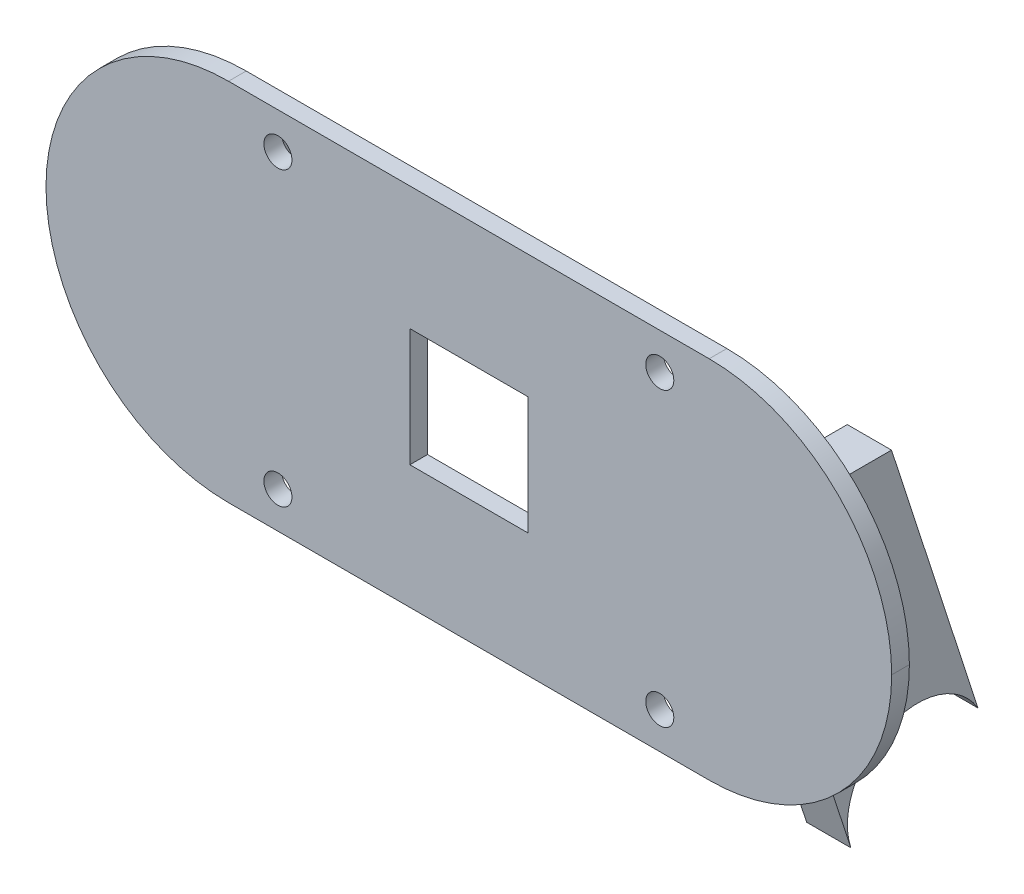
ISO-10303-21;
HEADER;
FILE_DESCRIPTION(('STEP AP214'),'2;1');
FILE_NAME('part.step','',(''),(''),'','','');
FILE_SCHEMA(('AUTOMOTIVE_DESIGN { 1 0 10303 214 1 1 1 1 }'));
ENDSEC;
DATA;
#1=APPLICATION_CONTEXT('core data for automotive mechanical design processes');
#2=APPLICATION_PROTOCOL_DEFINITION('international standard','automotive_design',2000,#1);
#3=PRODUCT_CONTEXT('',#1,'mechanical');
#4=PRODUCT('Part','Part','',(#3));
#5=PRODUCT_RELATED_PRODUCT_CATEGORY('part','',(#4));
#6=PRODUCT_DEFINITION_FORMATION('','',#4);
#7=PRODUCT_DEFINITION_CONTEXT('part definition',#1,'design');
#8=PRODUCT_DEFINITION('design','',#6,#7);
#9=PRODUCT_DEFINITION_SHAPE('','',#8);
#10=(LENGTH_UNIT() NAMED_UNIT(*) SI_UNIT(.MILLI.,.METRE.));
#11=(NAMED_UNIT(*) PLANE_ANGLE_UNIT() SI_UNIT($,.RADIAN.));
#12=(NAMED_UNIT(*) SI_UNIT($,.STERADIAN.) SOLID_ANGLE_UNIT());
#13=UNCERTAINTY_MEASURE_WITH_UNIT(LENGTH_MEASURE(1.E-05),#10,'distance_accuracy_value','');
#14=(GEOMETRIC_REPRESENTATION_CONTEXT(3) GLOBAL_UNCERTAINTY_ASSIGNED_CONTEXT((#13)) GLOBAL_UNIT_ASSIGNED_CONTEXT((#10,
#11,#12)) REPRESENTATION_CONTEXT('',''));
#15=CARTESIAN_POINT('',(0.,0.,0.));
#16=DIRECTION('',(0.,0.,1.));
#17=DIRECTION('',(1.,0.,0.));
#18=AXIS2_PLACEMENT_3D('',#15,#16,#17);
#19=CARTESIAN_POINT('',(0.,0.,4.));
#20=DIRECTION('',(0.,0.,1.));
#21=DIRECTION('',(1.,0.,0.));
#22=AXIS2_PLACEMENT_3D('',#19,#20,#21);
#23=PLANE('',#22);
#24=CARTESIAN_POINT('',(43.18,-33.02,4.));
#25=DIRECTION('',(0.,0.,1.));
#26=DIRECTION('',(1.,0.,0.));
#27=AXIS2_PLACEMENT_3D('',#24,#25,#26);
#28=CIRCLE('',#27,3.175);
#29=CARTESIAN_POINT('',(46.355,-33.02,4.));
#30=VERTEX_POINT('',#29);
#31=EDGE_CURVE('E295',#30,#30,#28,.T.);
#32=ORIENTED_EDGE('',*,*,#31,.F.);
#33=EDGE_LOOP('',(#32));
#34=FACE_BOUND('',#33,.T.);
#35=CARTESIAN_POINT('',(-43.18,33.02,4.));
#36=DIRECTION('',(0.,0.,1.));
#37=DIRECTION('',(1.,0.,0.));
#38=AXIS2_PLACEMENT_3D('',#35,#36,#37);
#39=CIRCLE('',#38,3.175);
#40=CARTESIAN_POINT('',(-40.005,33.02,4.));
#41=VERTEX_POINT('',#40);
#42=EDGE_CURVE('E307',#41,#41,#39,.T.);
#43=ORIENTED_EDGE('',*,*,#42,.F.);
#44=EDGE_LOOP('',(#43));
#45=FACE_BOUND('',#44,.T.);
#46=DIRECTION('',(1.,0.,0.));
#47=VECTOR('',#46,1.);
#48=CARTESIAN_POINT('',(-95.631,-41.275,4.));
#49=LINE('',#48,#47);
#50=CARTESIAN_POINT('',(-54.356,-41.275,4.));
#51=VERTEX_POINT('',#50);
#52=CARTESIAN_POINT('',(54.356,-41.275,4.));
#53=VERTEX_POINT('',#52);
#54=EDGE_CURVE('E316',#51,#53,#49,.T.);
#55=ORIENTED_EDGE('',*,*,#54,.T.);
#56=CARTESIAN_POINT('',(54.356,0.,4.));
#57=DIRECTION('',(0.,0.,1.));
#58=DIRECTION('',(1.,0.,0.));
#59=AXIS2_PLACEMENT_3D('',#56,#57,#58);
#60=CIRCLE('',#59,41.275);
#61=CARTESIAN_POINT('',(95.631,0.,4.));
#62=VERTEX_POINT('',#61);
#63=EDGE_CURVE('E344',#53,#62,#60,.T.);
#64=ORIENTED_EDGE('',*,*,#63,.T.);
#65=CARTESIAN_POINT('',(54.356,0.,4.));
#66=DIRECTION('',(0.,0.,1.));
#67=DIRECTION('',(1.,0.,0.));
#68=AXIS2_PLACEMENT_3D('',#65,#66,#67);
#69=CIRCLE('',#68,41.275);
#70=CARTESIAN_POINT('',(54.356,41.275,4.));
#71=VERTEX_POINT('',#70);
#72=EDGE_CURVE('E342',#62,#71,#69,.T.);
#73=ORIENTED_EDGE('',*,*,#72,.T.);
#74=DIRECTION('',(-1.,0.,0.));
#75=VECTOR('',#74,1.);
#76=CARTESIAN_POINT('',(-95.631,41.275,4.));
#77=LINE('',#76,#75);
#78=CARTESIAN_POINT('',(-54.356,41.275,4.));
#79=VERTEX_POINT('',#78);
#80=EDGE_CURVE('E313',#71,#79,#77,.T.);
#81=ORIENTED_EDGE('',*,*,#80,.T.);
#82=CARTESIAN_POINT('',(-54.356,0.,4.));
#83=DIRECTION('',(0.,0.,1.));
#84=DIRECTION('',(1.,0.,0.));
#85=AXIS2_PLACEMENT_3D('',#82,#83,#84);
#86=CIRCLE('',#85,41.275);
#87=CARTESIAN_POINT('',(-95.631,0.,4.));
#88=VERTEX_POINT('',#87);
#89=EDGE_CURVE('E338',#79,#88,#86,.T.);
#90=ORIENTED_EDGE('',*,*,#89,.T.);
#91=CARTESIAN_POINT('',(-54.356,0.,4.));
#92=DIRECTION('',(0.,0.,1.));
#93=DIRECTION('',(1.,0.,0.));
#94=AXIS2_PLACEMENT_3D('',#91,#92,#93);
#95=CIRCLE('',#94,41.275);
#96=EDGE_CURVE('E340',#88,#51,#95,.T.);
#97=ORIENTED_EDGE('',*,*,#96,.T.);
#98=EDGE_LOOP('',(#55,#64,#73,#81,#90,#97));
#99=FACE_BOUND('',#98,.T.);
#100=CARTESIAN_POINT('',(43.18,33.02,4.));
#101=DIRECTION('',(0.,0.,1.));
#102=DIRECTION('',(1.,0.,0.));
#103=AXIS2_PLACEMENT_3D('',#100,#101,#102);
#104=CIRCLE('',#103,3.175);
#105=CARTESIAN_POINT('',(46.355,33.02,4.));
#106=VERTEX_POINT('',#105);
#107=EDGE_CURVE('E301',#106,#106,#104,.T.);
#108=ORIENTED_EDGE('',*,*,#107,.F.);
#109=EDGE_LOOP('',(#108));
#110=FACE_BOUND('',#109,.T.);
#111=CARTESIAN_POINT('',(-43.18,-33.02,4.));
#112=DIRECTION('',(0.,0.,1.));
#113=DIRECTION('',(1.,0.,0.));
#114=AXIS2_PLACEMENT_3D('',#111,#112,#113);
#115=CIRCLE('',#114,3.175);
#116=CARTESIAN_POINT('',(-40.005,-33.02,4.));
#117=VERTEX_POINT('',#116);
#118=EDGE_CURVE('E289',#117,#117,#115,.T.);
#119=ORIENTED_EDGE('',*,*,#118,.F.);
#120=EDGE_LOOP('',(#119));
#121=FACE_BOUND('',#120,.T.);
#122=DIRECTION('',(-1.,0.,0.));
#123=VECTOR('',#122,1.);
#124=CARTESIAN_POINT('',(-13.335,13.335,4.));
#125=LINE('',#124,#123);
#126=CARTESIAN_POINT('',(13.335,13.335,4.));
#127=VERTEX_POINT('',#126);
#128=CARTESIAN_POINT('',(-13.335,13.335,4.));
#129=VERTEX_POINT('',#128);
#130=EDGE_CURVE('E258',#127,#129,#125,.T.);
#131=ORIENTED_EDGE('',*,*,#130,.F.);
#132=DIRECTION('',(0.,1.,0.));
#133=VECTOR('',#132,1.);
#134=CARTESIAN_POINT('',(13.335,13.335,4.));
#135=LINE('',#134,#133);
#136=CARTESIAN_POINT('',(13.335,-13.335,4.));
#137=VERTEX_POINT('',#136);
#138=EDGE_CURVE('E256',#137,#127,#135,.T.);
#139=ORIENTED_EDGE('',*,*,#138,.F.);
#140=DIRECTION('',(1.,0.,0.));
#141=VECTOR('',#140,1.);
#142=CARTESIAN_POINT('',(-13.335,-13.335,4.));
#143=LINE('',#142,#141);
#144=CARTESIAN_POINT('',(-13.335,-13.335,4.));
#145=VERTEX_POINT('',#144);
#146=EDGE_CURVE('E264',#145,#137,#143,.T.);
#147=ORIENTED_EDGE('',*,*,#146,.F.);
#148=DIRECTION('',(0.,-1.,0.));
#149=VECTOR('',#148,1.);
#150=CARTESIAN_POINT('',(-13.335,13.335,4.));
#151=LINE('',#150,#149);
#152=EDGE_CURVE('E261',#129,#145,#151,.T.);
#153=ORIENTED_EDGE('',*,*,#152,.F.);
#154=EDGE_LOOP('',(#131,#139,#147,#153));
#155=FACE_BOUND('',#154,.T.);
#156=ADVANCED_FACE('F33',(#34,#45,#99,#110,#121,#155),#23,.T.);
#157=CARTESIAN_POINT('',(0.,0.,0.));
#158=DIRECTION('',(0.,0.,1.));
#159=DIRECTION('',(1.,0.,0.));
#160=AXIS2_PLACEMENT_3D('',#157,#158,#159);
#161=PLANE('',#160);
#162=DIRECTION('',(1.,0.,0.));
#163=VECTOR('',#162,1.);
#164=CARTESIAN_POINT('',(-68.41,20.,0.));
#165=LINE('',#164,#163);
#166=CARTESIAN_POINT('',(-68.41,20.,0.));
#167=VERTEX_POINT('',#166);
#168=CARTESIAN_POINT('',(-58.41,20.,0.));
#169=VERTEX_POINT('',#168);
#170=EDGE_CURVE('E50',#167,#169,#165,.T.);
#171=ORIENTED_EDGE('',*,*,#170,.F.);
#172=DIRECTION('',(0.,-1.,0.));
#173=VECTOR('',#172,1.);
#174=CARTESIAN_POINT('',(-68.41,20.,0.));
#175=LINE('',#174,#173);
#176=CARTESIAN_POINT('',(-68.41,-20.,0.));
#177=VERTEX_POINT('',#176);
#178=EDGE_CURVE('E54',#167,#177,#175,.T.);
#179=ORIENTED_EDGE('',*,*,#178,.T.);
#180=DIRECTION('',(1.,0.,0.));
#181=VECTOR('',#180,1.);
#182=CARTESIAN_POINT('',(-68.41,-20.,0.));
#183=LINE('',#182,#181);
#184=CARTESIAN_POINT('',(-58.41,-20.,0.));
#185=VERTEX_POINT('',#184);
#186=EDGE_CURVE('E180',#177,#185,#183,.T.);
#187=ORIENTED_EDGE('',*,*,#186,.T.);
#188=DIRECTION('',(0.,-1.,0.));
#189=VECTOR('',#188,1.);
#190=CARTESIAN_POINT('',(-58.41,20.,0.));
#191=LINE('',#190,#189);
#192=EDGE_CURVE('E200',#169,#185,#191,.T.);
#193=ORIENTED_EDGE('',*,*,#192,.F.);
#194=EDGE_LOOP('',(#171,#179,#187,#193));
#195=FACE_BOUND('',#194,.T.);
#196=DIRECTION('',(1.,0.,0.));
#197=VECTOR('',#196,1.);
#198=CARTESIAN_POINT('',(61.59,20.,0.));
#199=LINE('',#198,#197);
#200=CARTESIAN_POINT('',(61.59,20.,0.));
#201=VERTEX_POINT('',#200);
#202=CARTESIAN_POINT('',(71.59,20.,0.));
#203=VERTEX_POINT('',#202);
#204=EDGE_CURVE('E246',#201,#203,#199,.T.);
#205=ORIENTED_EDGE('',*,*,#204,.F.);
#206=DIRECTION('',(0.,-1.,0.));
#207=VECTOR('',#206,1.);
#208=CARTESIAN_POINT('',(61.59,20.,0.));
#209=LINE('',#208,#207);
#210=CARTESIAN_POINT('',(61.59,-20.,0.));
#211=VERTEX_POINT('',#210);
#212=EDGE_CURVE('E217',#201,#211,#209,.T.);
#213=ORIENTED_EDGE('',*,*,#212,.T.);
#214=DIRECTION('',(1.,0.,0.));
#215=VECTOR('',#214,1.);
#216=CARTESIAN_POINT('',(61.59,-20.,0.));
#217=LINE('',#216,#215);
#218=CARTESIAN_POINT('',(71.59,-20.,0.));
#219=VERTEX_POINT('',#218);
#220=EDGE_CURVE('E232',#211,#219,#217,.T.);
#221=ORIENTED_EDGE('',*,*,#220,.T.);
#222=DIRECTION('',(0.,-1.,0.));
#223=VECTOR('',#222,1.);
#224=CARTESIAN_POINT('',(71.59,20.,0.));
#225=LINE('',#224,#223);
#226=EDGE_CURVE('E212',#203,#219,#225,.T.);
#227=ORIENTED_EDGE('',*,*,#226,.F.);
#228=EDGE_LOOP('',(#205,#213,#221,#227));
#229=FACE_BOUND('',#228,.T.);
#230=CARTESIAN_POINT('',(-43.18,-33.02,0.));
#231=DIRECTION('',(0.,0.,1.));
#232=DIRECTION('',(1.,0.,0.));
#233=AXIS2_PLACEMENT_3D('',#230,#231,#232);
#234=CIRCLE('',#233,3.175);
#235=CARTESIAN_POINT('',(-40.005,-33.02,0.));
#236=VERTEX_POINT('',#235);
#237=EDGE_CURVE('E288',#236,#236,#234,.T.);
#238=ORIENTED_EDGE('',*,*,#237,.T.);
#239=EDGE_LOOP('',(#238));
#240=FACE_BOUND('',#239,.T.);
#241=CARTESIAN_POINT('',(43.18,-33.02,0.));
#242=DIRECTION('',(0.,0.,1.));
#243=DIRECTION('',(1.,0.,0.));
#244=AXIS2_PLACEMENT_3D('',#241,#242,#243);
#245=CIRCLE('',#244,3.175);
#246=CARTESIAN_POINT('',(46.355,-33.02,0.));
#247=VERTEX_POINT('',#246);
#248=EDGE_CURVE('E292',#247,#247,#245,.T.);
#249=ORIENTED_EDGE('',*,*,#248,.T.);
#250=EDGE_LOOP('',(#249));
#251=FACE_BOUND('',#250,.T.);
#252=CARTESIAN_POINT('',(43.18,33.02,0.));
#253=DIRECTION('',(0.,0.,1.));
#254=DIRECTION('',(1.,0.,0.));
#255=AXIS2_PLACEMENT_3D('',#252,#253,#254);
#256=CIRCLE('',#255,3.175);
#257=CARTESIAN_POINT('',(46.355,33.02,0.));
#258=VERTEX_POINT('',#257);
#259=EDGE_CURVE('E298',#258,#258,#256,.T.);
#260=ORIENTED_EDGE('',*,*,#259,.T.);
#261=EDGE_LOOP('',(#260));
#262=FACE_BOUND('',#261,.T.);
#263=CARTESIAN_POINT('',(-43.18,33.02,0.));
#264=DIRECTION('',(0.,0.,1.));
#265=DIRECTION('',(1.,0.,0.));
#266=AXIS2_PLACEMENT_3D('',#263,#264,#265);
#267=CIRCLE('',#266,3.175);
#268=CARTESIAN_POINT('',(-40.005,33.02,0.));
#269=VERTEX_POINT('',#268);
#270=EDGE_CURVE('E304',#269,#269,#267,.T.);
#271=ORIENTED_EDGE('',*,*,#270,.T.);
#272=EDGE_LOOP('',(#271));
#273=FACE_BOUND('',#272,.T.);
#274=CARTESIAN_POINT('',(54.356,0.,0.));
#275=DIRECTION('',(0.,0.,1.));
#276=DIRECTION('',(1.,0.,0.));
#277=AXIS2_PLACEMENT_3D('',#274,#275,#276);
#278=CIRCLE('',#277,41.275);
#279=CARTESIAN_POINT('',(54.356,41.275,0.));
#280=VERTEX_POINT('',#279);
#281=CARTESIAN_POINT('',(95.631,0.,0.));
#282=VERTEX_POINT('',#281);
#283=EDGE_CURVE('E334',#280,#282,#278,.F.);
#284=ORIENTED_EDGE('',*,*,#283,.T.);
#285=CARTESIAN_POINT('',(54.356,0.,0.));
#286=DIRECTION('',(0.,0.,1.));
#287=DIRECTION('',(1.,0.,0.));
#288=AXIS2_PLACEMENT_3D('',#285,#286,#287);
#289=CIRCLE('',#288,41.275);
#290=CARTESIAN_POINT('',(54.356,-41.275,0.));
#291=VERTEX_POINT('',#290);
#292=EDGE_CURVE('E336',#282,#291,#289,.F.);
#293=ORIENTED_EDGE('',*,*,#292,.T.);
#294=DIRECTION('',(1.,0.,0.));
#295=VECTOR('',#294,1.);
#296=CARTESIAN_POINT('',(-95.631,-41.275,0.));
#297=LINE('',#296,#295);
#298=CARTESIAN_POINT('',(-54.356,-41.275,0.));
#299=VERTEX_POINT('',#298);
#300=EDGE_CURVE('E317',#299,#291,#297,.T.);
#301=ORIENTED_EDGE('',*,*,#300,.F.);
#302=CARTESIAN_POINT('',(-54.356,0.,0.));
#303=DIRECTION('',(0.,0.,1.));
#304=DIRECTION('',(1.,0.,0.));
#305=AXIS2_PLACEMENT_3D('',#302,#303,#304);
#306=CIRCLE('',#305,41.275);
#307=CARTESIAN_POINT('',(-95.631,0.,0.));
#308=VERTEX_POINT('',#307);
#309=EDGE_CURVE('E332',#299,#308,#306,.F.);
#310=ORIENTED_EDGE('',*,*,#309,.T.);
#311=CARTESIAN_POINT('',(-54.356,0.,0.));
#312=DIRECTION('',(0.,0.,1.));
#313=DIRECTION('',(1.,0.,0.));
#314=AXIS2_PLACEMENT_3D('',#311,#312,#313);
#315=CIRCLE('',#314,41.275);
#316=CARTESIAN_POINT('',(-54.356,41.275,0.));
#317=VERTEX_POINT('',#316);
#318=EDGE_CURVE('E330',#308,#317,#315,.F.);
#319=ORIENTED_EDGE('',*,*,#318,.T.);
#320=DIRECTION('',(-1.,0.,0.));
#321=VECTOR('',#320,1.);
#322=CARTESIAN_POINT('',(-95.631,41.275,0.));
#323=LINE('',#322,#321);
#324=EDGE_CURVE('E310',#280,#317,#323,.T.);
#325=ORIENTED_EDGE('',*,*,#324,.F.);
#326=EDGE_LOOP('',(#284,#293,#301,#310,#319,#325));
#327=FACE_BOUND('',#326,.T.);
#328=DIRECTION('',(0.,1.,0.));
#329=VECTOR('',#328,1.);
#330=CARTESIAN_POINT('',(13.335,13.335,0.));
#331=LINE('',#330,#329);
#332=CARTESIAN_POINT('',(13.335,-13.335,0.));
#333=VERTEX_POINT('',#332);
#334=CARTESIAN_POINT('',(13.335,13.335,0.));
#335=VERTEX_POINT('',#334);
#336=EDGE_CURVE('E267',#333,#335,#331,.T.);
#337=ORIENTED_EDGE('',*,*,#336,.T.);
#338=DIRECTION('',(-1.,0.,0.));
#339=VECTOR('',#338,1.);
#340=CARTESIAN_POINT('',(-13.335,13.335,0.));
#341=LINE('',#340,#339);
#342=CARTESIAN_POINT('',(-13.335,13.335,0.));
#343=VERTEX_POINT('',#342);
#344=EDGE_CURVE('E270',#335,#343,#341,.T.);
#345=ORIENTED_EDGE('',*,*,#344,.T.);
#346=DIRECTION('',(0.,-1.,0.));
#347=VECTOR('',#346,1.);
#348=CARTESIAN_POINT('',(-13.335,13.335,0.));
#349=LINE('',#348,#347);
#350=CARTESIAN_POINT('',(-13.335,-13.335,0.));
#351=VERTEX_POINT('',#350);
#352=EDGE_CURVE('E274',#343,#351,#349,.T.);
#353=ORIENTED_EDGE('',*,*,#352,.T.);
#354=DIRECTION('',(1.,0.,0.));
#355=VECTOR('',#354,1.);
#356=CARTESIAN_POINT('',(-13.335,-13.335,0.));
#357=LINE('',#356,#355);
#358=EDGE_CURVE('E259',#351,#333,#357,.T.);
#359=ORIENTED_EDGE('',*,*,#358,.T.);
#360=EDGE_LOOP('',(#337,#345,#353,#359));
#361=FACE_BOUND('',#360,.T.);
#362=ADVANCED_FACE('F378',(#195,#229,#240,#251,#262,#273,#327,#361),#161,.F.);
#363=CARTESIAN_POINT('',(-95.631,41.275,4.));
#364=DIRECTION('',(0.,-1.,0.));
#365=DIRECTION('',(0.,0.,-1.));
#366=AXIS2_PLACEMENT_3D('',#363,#364,#365);
#367=PLANE('',#366);
#368=ORIENTED_EDGE('',*,*,#80,.F.);
#369=DIRECTION('',(0.,0.,-1.));
#370=VECTOR('',#369,1.);
#371=CARTESIAN_POINT('',(54.356,41.275,4.));
#372=LINE('',#371,#370);
#373=EDGE_CURVE('E11',#71,#280,#372,.T.);
#374=ORIENTED_EDGE('',*,*,#373,.T.);
#375=ORIENTED_EDGE('',*,*,#324,.T.);
#376=DIRECTION('',(0.,0.,-1.));
#377=VECTOR('',#376,1.);
#378=CARTESIAN_POINT('',(-54.356,41.275,4.));
#379=LINE('',#378,#377);
#380=EDGE_CURVE('E42',#317,#79,#379,.F.);
#381=ORIENTED_EDGE('',*,*,#380,.T.);
#382=EDGE_LOOP('',(#368,#374,#375,#381));
#383=FACE_BOUND('',#382,.T.);
#384=ADVANCED_FACE('F365',(#383),#367,.F.);
#385=CARTESIAN_POINT('',(-95.631,-41.275,4.));
#386=DIRECTION('',(0.,1.,0.));
#387=DIRECTION('',(0.,0.,1.));
#388=AXIS2_PLACEMENT_3D('',#385,#386,#387);
#389=PLANE('',#388);
#390=ORIENTED_EDGE('',*,*,#54,.F.);
#391=DIRECTION('',(0.,0.,-1.));
#392=VECTOR('',#391,1.);
#393=CARTESIAN_POINT('',(-54.356,-41.275,4.));
#394=LINE('',#393,#392);
#395=EDGE_CURVE('E327',#51,#299,#394,.T.);
#396=ORIENTED_EDGE('',*,*,#395,.T.);
#397=ORIENTED_EDGE('',*,*,#300,.T.);
#398=DIRECTION('',(0.,0.,-1.));
#399=VECTOR('',#398,1.);
#400=CARTESIAN_POINT('',(54.356,-41.275,4.));
#401=LINE('',#400,#399);
#402=EDGE_CURVE('E320',#291,#53,#401,.F.);
#403=ORIENTED_EDGE('',*,*,#402,.T.);
#404=EDGE_LOOP('',(#390,#396,#397,#403));
#405=FACE_BOUND('',#404,.T.);
#406=ADVANCED_FACE('F374',(#405),#389,.F.);
#407=CARTESIAN_POINT('',(-43.18,33.02,4.));
#408=DIRECTION('',(0.,0.,-1.));
#409=DIRECTION('',(-1.,0.,0.));
#410=AXIS2_PLACEMENT_3D('',#407,#408,#409);
#411=CYLINDRICAL_SURFACE('',#410,3.175);
#412=ORIENTED_EDGE('',*,*,#42,.T.);
#413=EDGE_LOOP('',(#412));
#414=FACE_BOUND('',#413,.T.);
#415=ORIENTED_EDGE('',*,*,#270,.F.);
#416=EDGE_LOOP('',(#415));
#417=FACE_BOUND('',#416,.T.);
#418=ADVANCED_FACE('F416',(#414,#417),#411,.F.);
#419=CARTESIAN_POINT('',(43.18,33.02,4.));
#420=DIRECTION('',(0.,0.,-1.));
#421=DIRECTION('',(-1.,0.,0.));
#422=AXIS2_PLACEMENT_3D('',#419,#420,#421);
#423=CYLINDRICAL_SURFACE('',#422,3.175);
#424=ORIENTED_EDGE('',*,*,#107,.T.);
#425=EDGE_LOOP('',(#424));
#426=FACE_BOUND('',#425,.T.);
#427=ORIENTED_EDGE('',*,*,#259,.F.);
#428=EDGE_LOOP('',(#427));
#429=FACE_BOUND('',#428,.T.);
#430=ADVANCED_FACE('F478',(#426,#429),#423,.F.);
#431=CARTESIAN_POINT('',(43.18,-33.02,4.));
#432=DIRECTION('',(0.,0.,-1.));
#433=DIRECTION('',(-1.,0.,0.));
#434=AXIS2_PLACEMENT_3D('',#431,#432,#433);
#435=CYLINDRICAL_SURFACE('',#434,3.175);
#436=ORIENTED_EDGE('',*,*,#31,.T.);
#437=EDGE_LOOP('',(#436));
#438=FACE_BOUND('',#437,.T.);
#439=ORIENTED_EDGE('',*,*,#248,.F.);
#440=EDGE_LOOP('',(#439));
#441=FACE_BOUND('',#440,.T.);
#442=ADVANCED_FACE('F484',(#438,#441),#435,.F.);
#443=CARTESIAN_POINT('',(-43.18,-33.02,4.));
#444=DIRECTION('',(0.,0.,-1.));
#445=DIRECTION('',(-1.,0.,0.));
#446=AXIS2_PLACEMENT_3D('',#443,#444,#445);
#447=CYLINDRICAL_SURFACE('',#446,3.175);
#448=ORIENTED_EDGE('',*,*,#118,.T.);
#449=EDGE_LOOP('',(#448));
#450=FACE_BOUND('',#449,.T.);
#451=ORIENTED_EDGE('',*,*,#237,.F.);
#452=EDGE_LOOP('',(#451));
#453=FACE_BOUND('',#452,.T.);
#454=ADVANCED_FACE('F491',(#450,#453),#447,.F.);
#455=CARTESIAN_POINT('',(13.335,13.335,4.));
#456=DIRECTION('',(-1.,0.,0.));
#457=DIRECTION('',(0.,0.,1.));
#458=AXIS2_PLACEMENT_3D('',#455,#456,#457);
#459=PLANE('',#458);
#460=ORIENTED_EDGE('',*,*,#336,.F.);
#461=DIRECTION('',(0.,0.,-1.));
#462=VECTOR('',#461,1.);
#463=CARTESIAN_POINT('',(13.335,-13.335,4.));
#464=LINE('',#463,#462);
#465=EDGE_CURVE('E266',#137,#333,#464,.T.);
#466=ORIENTED_EDGE('',*,*,#465,.F.);
#467=ORIENTED_EDGE('',*,*,#138,.T.);
#468=DIRECTION('',(0.,0.,-1.));
#469=VECTOR('',#468,1.);
#470=CARTESIAN_POINT('',(13.335,13.335,4.));
#471=LINE('',#470,#469);
#472=EDGE_CURVE('E285',#127,#335,#471,.T.);
#473=ORIENTED_EDGE('',*,*,#472,.T.);
#474=EDGE_LOOP('',(#460,#466,#467,#473));
#475=FACE_BOUND('',#474,.T.);
#476=ADVANCED_FACE('F385',(#475),#459,.T.);
#477=CARTESIAN_POINT('',(-13.335,13.335,4.));
#478=DIRECTION('',(0.,-1.,0.));
#479=DIRECTION('',(0.,0.,-1.));
#480=AXIS2_PLACEMENT_3D('',#477,#478,#479);
#481=PLANE('',#480);
#482=ORIENTED_EDGE('',*,*,#344,.F.);
#483=ORIENTED_EDGE('',*,*,#472,.F.);
#484=ORIENTED_EDGE('',*,*,#130,.T.);
#485=DIRECTION('',(0.,0.,-1.));
#486=VECTOR('',#485,1.);
#487=CARTESIAN_POINT('',(-13.335,13.335,4.));
#488=LINE('',#487,#486);
#489=EDGE_CURVE('E283',#129,#343,#488,.T.);
#490=ORIENTED_EDGE('',*,*,#489,.T.);
#491=EDGE_LOOP('',(#482,#483,#484,#490));
#492=FACE_BOUND('',#491,.T.);
#493=ADVANCED_FACE('F395',(#492),#481,.T.);
#494=CARTESIAN_POINT('',(-13.335,13.335,4.));
#495=DIRECTION('',(1.,0.,0.));
#496=DIRECTION('',(0.,0.,-1.));
#497=AXIS2_PLACEMENT_3D('',#494,#495,#496);
#498=PLANE('',#497);
#499=ORIENTED_EDGE('',*,*,#352,.F.);
#500=ORIENTED_EDGE('',*,*,#489,.F.);
#501=ORIENTED_EDGE('',*,*,#152,.T.);
#502=DIRECTION('',(0.,0.,-1.));
#503=VECTOR('',#502,1.);
#504=CARTESIAN_POINT('',(-13.335,-13.335,4.));
#505=LINE('',#504,#503);
#506=EDGE_CURVE('E281',#145,#351,#505,.T.);
#507=ORIENTED_EDGE('',*,*,#506,.T.);
#508=EDGE_LOOP('',(#499,#500,#501,#507));
#509=FACE_BOUND('',#508,.T.);
#510=ADVANCED_FACE('F399',(#509),#498,.T.);
#511=CARTESIAN_POINT('',(-13.335,-13.335,4.));
#512=DIRECTION('',(0.,1.,0.));
#513=DIRECTION('',(0.,0.,1.));
#514=AXIS2_PLACEMENT_3D('',#511,#512,#513);
#515=PLANE('',#514);
#516=ORIENTED_EDGE('',*,*,#358,.F.);
#517=ORIENTED_EDGE('',*,*,#506,.F.);
#518=ORIENTED_EDGE('',*,*,#146,.T.);
#519=ORIENTED_EDGE('',*,*,#465,.T.);
#520=EDGE_LOOP('',(#516,#517,#518,#519));
#521=FACE_BOUND('',#520,.T.);
#522=ADVANCED_FACE('F389',(#521),#515,.T.);
#523=CARTESIAN_POINT('',(-54.356,0.,4.));
#524=DIRECTION('',(0.,0.,-1.));
#525=DIRECTION('',(-1.,0.,0.));
#526=AXIS2_PLACEMENT_3D('',#523,#524,#525);
#527=CYLINDRICAL_SURFACE('',#526,41.275);
#528=DIRECTION('',(0.,0.,-1.));
#529=VECTOR('',#528,1.);
#530=CARTESIAN_POINT('',(-95.631,0.,4.));
#531=LINE('',#530,#529);
#532=EDGE_CURVE('E271',#88,#308,#531,.T.);
#533=ORIENTED_EDGE('',*,*,#532,.F.);
#534=ORIENTED_EDGE('',*,*,#89,.F.);
#535=ORIENTED_EDGE('',*,*,#380,.F.);
#536=ORIENTED_EDGE('',*,*,#318,.F.);
#537=EDGE_LOOP('',(#533,#534,#535,#536));
#538=FACE_BOUND('',#537,.T.);
#539=ADVANCED_FACE('F370',(#538),#527,.T.);
#540=CARTESIAN_POINT('',(-54.356,0.,4.));
#541=DIRECTION('',(0.,0.,-1.));
#542=DIRECTION('',(-1.,0.,0.));
#543=AXIS2_PLACEMENT_3D('',#540,#541,#542);
#544=CYLINDRICAL_SURFACE('',#543,41.275);
#545=ORIENTED_EDGE('',*,*,#96,.F.);
#546=ORIENTED_EDGE('',*,*,#532,.T.);
#547=ORIENTED_EDGE('',*,*,#309,.F.);
#548=ORIENTED_EDGE('',*,*,#395,.F.);
#549=EDGE_LOOP('',(#545,#546,#547,#548));
#550=FACE_BOUND('',#549,.T.);
#551=ADVANCED_FACE('F376',(#550),#544,.T.);
#552=CARTESIAN_POINT('',(54.356,0.,4.));
#553=DIRECTION('',(0.,0.,-1.));
#554=DIRECTION('',(-1.,0.,0.));
#555=AXIS2_PLACEMENT_3D('',#552,#553,#554);
#556=CYLINDRICAL_SURFACE('',#555,41.275);
#557=ORIENTED_EDGE('',*,*,#373,.F.);
#558=ORIENTED_EDGE('',*,*,#72,.F.);
#559=DIRECTION('',(0.,0.,-1.));
#560=VECTOR('',#559,1.);
#561=CARTESIAN_POINT('',(95.631,0.,4.));
#562=LINE('',#561,#560);
#563=EDGE_CURVE('E37',#282,#62,#562,.F.);
#564=ORIENTED_EDGE('',*,*,#563,.F.);
#565=ORIENTED_EDGE('',*,*,#283,.F.);
#566=EDGE_LOOP('',(#557,#558,#564,#565));
#567=FACE_BOUND('',#566,.T.);
#568=ADVANCED_FACE('F35',(#567),#556,.T.);
#569=CARTESIAN_POINT('',(54.356,0.,4.));
#570=DIRECTION('',(0.,0.,-1.));
#571=DIRECTION('',(-1.,0.,0.));
#572=AXIS2_PLACEMENT_3D('',#569,#570,#571);
#573=CYLINDRICAL_SURFACE('',#572,41.275);
#574=ORIENTED_EDGE('',*,*,#63,.F.);
#575=ORIENTED_EDGE('',*,*,#402,.F.);
#576=ORIENTED_EDGE('',*,*,#292,.F.);
#577=ORIENTED_EDGE('',*,*,#563,.T.);
#578=EDGE_LOOP('',(#574,#575,#576,#577));
#579=FACE_BOUND('',#578,.T.);
#580=ADVANCED_FACE('F354',(#579),#573,.T.);
#581=CARTESIAN_POINT('',(61.59,20.,0.));
#582=DIRECTION('',(0.,1.,0.));
#583=DIRECTION('',(0.,0.,1.));
#584=AXIS2_PLACEMENT_3D('',#581,#582,#583);
#585=PLANE('',#584);
#586=DIRECTION('',(0.,0.,1.));
#587=VECTOR('',#586,1.);
#588=CARTESIAN_POINT('',(71.59,20.,0.));
#589=LINE('',#588,#587);
#590=CARTESIAN_POINT('',(71.59,20.,-20.));
#591=VERTEX_POINT('',#590);
#592=EDGE_CURVE('E220',#591,#203,#589,.T.);
#593=ORIENTED_EDGE('',*,*,#592,.F.);
#594=DIRECTION('',(1.,0.,0.));
#595=VECTOR('',#594,1.);
#596=CARTESIAN_POINT('',(61.59,20.,-20.));
#597=LINE('',#596,#595);
#598=CARTESIAN_POINT('',(61.59,20.,-20.));
#599=VERTEX_POINT('',#598);
#600=EDGE_CURVE('E249',#599,#591,#597,.T.);
#601=ORIENTED_EDGE('',*,*,#600,.F.);
#602=DIRECTION('',(0.,0.,1.));
#603=VECTOR('',#602,1.);
#604=CARTESIAN_POINT('',(61.59,20.,0.));
#605=LINE('',#604,#603);
#606=EDGE_CURVE('E229',#599,#201,#605,.T.);
#607=ORIENTED_EDGE('',*,*,#606,.T.);
#608=ORIENTED_EDGE('',*,*,#204,.T.);
#609=EDGE_LOOP('',(#593,#601,#607,#608));
#610=FACE_BOUND('',#609,.T.);
#611=ADVANCED_FACE('F427',(#610),#585,.T.);
#612=CARTESIAN_POINT('',(61.59,20.,-20.));
#613=DIRECTION('',(0.,0.308517726818044,-0.951218593299682));
#614=DIRECTION('',(0.,0.951218593299683,0.308517726818044));
#615=AXIS2_PLACEMENT_3D('',#612,#613,#614);
#616=PLANE('',#615);
#617=DIRECTION('',(0.,0.951218593299682,0.308517726818044));
#618=VECTOR('',#617,1.);
#619=CARTESIAN_POINT('',(71.59,20.,-20.));
#620=LINE('',#619,#618);
#621=CARTESIAN_POINT('',(71.59,-40.3108395767696,-39.5611852625452));
#622=VERTEX_POINT('',#621);
#623=EDGE_CURVE('E241',#622,#591,#620,.T.);
#624=ORIENTED_EDGE('',*,*,#623,.F.);
#625=DIRECTION('',(1.,0.,0.));
#626=VECTOR('',#625,1.);
#627=CARTESIAN_POINT('',(61.59,-40.3108395767696,-39.5611852625452));
#628=LINE('',#627,#626);
#629=CARTESIAN_POINT('',(61.59,-40.3108395767696,-39.5611852625452));
#630=VERTEX_POINT('',#629);
#631=EDGE_CURVE('E251',#630,#622,#628,.T.);
#632=ORIENTED_EDGE('',*,*,#631,.F.);
#633=DIRECTION('',(0.,0.951218593299682,0.308517726818044));
#634=VECTOR('',#633,1.);
#635=CARTESIAN_POINT('',(61.59,20.,-20.));
#636=LINE('',#635,#634);
#637=EDGE_CURVE('E226',#630,#599,#636,.T.);
#638=ORIENTED_EDGE('',*,*,#637,.T.);
#639=ORIENTED_EDGE('',*,*,#600,.T.);
#640=EDGE_LOOP('',(#624,#632,#638,#639));
#641=FACE_BOUND('',#640,.T.);
#642=ADVANCED_FACE('F432',(#641),#616,.T.);
#643=CARTESIAN_POINT('',(61.59,-48.3949318522524,-25.898715607264));
#644=DIRECTION('',(1.,0.,0.));
#645=DIRECTION('',(0.,0.,-1.));
#646=AXIS2_PLACEMENT_3D('',#643,#644,#645);
#647=CYLINDRICAL_SURFACE('',#646,15.875);
#648=CARTESIAN_POINT('',(71.59,-48.3949318522524,-25.898715607264));
#649=DIRECTION('',(-1.,0.,0.));
#650=DIRECTION('',(0.,0.,1.));
#651=AXIS2_PLACEMENT_3D('',#648,#649,#650);
#652=CIRCLE('',#651,15.875);
#653=CARTESIAN_POINT('',(71.59,-53.2926507654889,-10.7981204386316));
#654=VERTEX_POINT('',#653);
#655=EDGE_CURVE('E238',#654,#622,#652,.T.);
#656=ORIENTED_EDGE('',*,*,#655,.F.);
#657=DIRECTION('',(1.,0.,0.));
#658=VECTOR('',#657,1.);
#659=CARTESIAN_POINT('',(61.59,-53.2926507654889,-10.7981204386316));
#660=LINE('',#659,#658);
#661=CARTESIAN_POINT('',(61.59,-53.2926507654889,-10.7981204386316));
#662=VERTEX_POINT('',#661);
#663=EDGE_CURVE('E253',#662,#654,#660,.T.);
#664=ORIENTED_EDGE('',*,*,#663,.F.);
#665=CARTESIAN_POINT('',(61.59,-48.3949318522524,-25.898715607264));
#666=DIRECTION('',(-1.,0.,0.));
#667=DIRECTION('',(0.,0.,1.));
#668=AXIS2_PLACEMENT_3D('',#665,#666,#667);
#669=CIRCLE('',#668,15.875);
#670=EDGE_CURVE('E223',#662,#630,#669,.T.);
#671=ORIENTED_EDGE('',*,*,#670,.T.);
#672=ORIENTED_EDGE('',*,*,#631,.T.);
#673=EDGE_LOOP('',(#656,#664,#671,#672));
#674=FACE_BOUND('',#673,.T.);
#675=ADVANCED_FACE('F616',(#674),#647,.F.);
#676=CARTESIAN_POINT('',(61.59,-20.,0.));
#677=DIRECTION('',(0.,-0.308517726818044,0.951218593299682));
#678=DIRECTION('',(0.,-0.951218593299683,-0.308517726818045));
#679=AXIS2_PLACEMENT_3D('',#676,#677,#678);
#680=PLANE('',#679);
#681=DIRECTION('',(0.,-0.951218593299682,-0.308517726818044));
#682=VECTOR('',#681,1.);
#683=CARTESIAN_POINT('',(71.59,-20.,0.));
#684=LINE('',#683,#682);
#685=EDGE_CURVE('E235',#219,#654,#684,.T.);
#686=ORIENTED_EDGE('',*,*,#685,.F.);
#687=ORIENTED_EDGE('',*,*,#220,.F.);
#688=DIRECTION('',(0.,-0.951218593299682,-0.308517726818044));
#689=VECTOR('',#688,1.);
#690=CARTESIAN_POINT('',(61.59,-20.,0.));
#691=LINE('',#690,#689);
#692=EDGE_CURVE('E219',#211,#662,#691,.T.);
#693=ORIENTED_EDGE('',*,*,#692,.T.);
#694=ORIENTED_EDGE('',*,*,#663,.T.);
#695=EDGE_LOOP('',(#686,#687,#693,#694));
#696=FACE_BOUND('',#695,.T.);
#697=ADVANCED_FACE('F610',(#696),#680,.T.);
#698=CARTESIAN_POINT('',(61.59,-48.3949318522524,-25.898715607264));
#699=DIRECTION('',(-1.,0.,0.));
#700=DIRECTION('',(0.,0.,1.));
#701=AXIS2_PLACEMENT_3D('',#698,#699,#700);
#702=PLANE('',#701);
#703=ORIENTED_EDGE('',*,*,#212,.F.);
#704=ORIENTED_EDGE('',*,*,#606,.F.);
#705=ORIENTED_EDGE('',*,*,#637,.F.);
#706=ORIENTED_EDGE('',*,*,#670,.F.);
#707=ORIENTED_EDGE('',*,*,#692,.F.);
#708=EDGE_LOOP('',(#703,#704,#705,#706,#707));
#709=FACE_BOUND('',#708,.T.);
#710=ADVANCED_FACE('F607',(#709),#702,.T.);
#711=CARTESIAN_POINT('',(71.59,-48.3949318522524,-25.898715607264));
#712=DIRECTION('',(-1.,0.,0.));
#713=DIRECTION('',(0.,0.,1.));
#714=AXIS2_PLACEMENT_3D('',#711,#712,#713);
#715=PLANE('',#714);
#716=ORIENTED_EDGE('',*,*,#226,.T.);
#717=ORIENTED_EDGE('',*,*,#685,.T.);
#718=ORIENTED_EDGE('',*,*,#655,.T.);
#719=ORIENTED_EDGE('',*,*,#623,.T.);
#720=ORIENTED_EDGE('',*,*,#592,.T.);
#721=EDGE_LOOP('',(#716,#717,#718,#719,#720));
#722=FACE_BOUND('',#721,.T.);
#723=ADVANCED_FACE('F548',(#722),#715,.F.);
#724=CARTESIAN_POINT('',(-68.41,20.,0.));
#725=DIRECTION('',(0.,1.,0.));
#726=DIRECTION('',(0.,0.,1.));
#727=AXIS2_PLACEMENT_3D('',#724,#725,#726);
#728=PLANE('',#727);
#729=DIRECTION('',(0.,0.,1.));
#730=VECTOR('',#729,1.);
#731=CARTESIAN_POINT('',(-58.41,20.,0.));
#732=LINE('',#731,#730);
#733=CARTESIAN_POINT('',(-58.41,20.,-20.));
#734=VERTEX_POINT('',#733);
#735=EDGE_CURVE('E193',#734,#169,#732,.T.);
#736=ORIENTED_EDGE('',*,*,#735,.F.);
#737=DIRECTION('',(1.,0.,0.));
#738=VECTOR('',#737,1.);
#739=CARTESIAN_POINT('',(-68.41,20.,-20.));
#740=LINE('',#739,#738);
#741=CARTESIAN_POINT('',(-68.41,20.,-20.));
#742=VERTEX_POINT('',#741);
#743=EDGE_CURVE('E213',#742,#734,#740,.T.);
#744=ORIENTED_EDGE('',*,*,#743,.F.);
#745=DIRECTION('',(0.,0.,1.));
#746=VECTOR('',#745,1.);
#747=CARTESIAN_POINT('',(-68.41,20.,0.));
#748=LINE('',#747,#746);
#749=EDGE_CURVE('E197',#742,#167,#748,.T.);
#750=ORIENTED_EDGE('',*,*,#749,.T.);
#751=ORIENTED_EDGE('',*,*,#170,.T.);
#752=EDGE_LOOP('',(#736,#744,#750,#751));
#753=FACE_BOUND('',#752,.T.);
#754=ADVANCED_FACE('F553',(#753),#728,.T.);
#755=CARTESIAN_POINT('',(-68.41,20.,-20.));
#756=DIRECTION('',(0.,0.308517726818044,-0.951218593299682));
#757=DIRECTION('',(0.,0.951218593299683,0.308517726818044));
#758=AXIS2_PLACEMENT_3D('',#755,#756,#757);
#759=PLANE('',#758);
#760=DIRECTION('',(0.,0.951218593299682,0.308517726818044));
#761=VECTOR('',#760,1.);
#762=CARTESIAN_POINT('',(-58.41,20.,-20.));
#763=LINE('',#762,#761);
#764=CARTESIAN_POINT('',(-58.41,-40.3108395767696,-39.5611852625452));
#765=VERTEX_POINT('',#764);
#766=EDGE_CURVE('E206',#765,#734,#763,.T.);
#767=ORIENTED_EDGE('',*,*,#766,.F.);
#768=DIRECTION('',(1.,0.,0.));
#769=VECTOR('',#768,1.);
#770=CARTESIAN_POINT('',(-68.41,-40.3108395767696,-39.5611852625452));
#771=LINE('',#770,#769);
#772=CARTESIAN_POINT('',(-68.41,-40.3108395767696,-39.5611852625452));
#773=VERTEX_POINT('',#772);
#774=EDGE_CURVE('E179',#773,#765,#771,.T.);
#775=ORIENTED_EDGE('',*,*,#774,.F.);
#776=DIRECTION('',(0.,0.951218593299682,0.308517726818044));
#777=VECTOR('',#776,1.);
#778=CARTESIAN_POINT('',(-68.41,20.,-20.));
#779=LINE('',#778,#777);
#780=EDGE_CURVE('E189',#773,#742,#779,.T.);
#781=ORIENTED_EDGE('',*,*,#780,.T.);
#782=ORIENTED_EDGE('',*,*,#743,.T.);
#783=EDGE_LOOP('',(#767,#775,#781,#782));
#784=FACE_BOUND('',#783,.T.);
#785=ADVANCED_FACE('F558',(#784),#759,.T.);
#786=CARTESIAN_POINT('',(-68.41,-48.3949318522524,-25.898715607264));
#787=DIRECTION('',(1.,0.,0.));
#788=DIRECTION('',(0.,0.,-1.));
#789=AXIS2_PLACEMENT_3D('',#786,#787,#788);
#790=CYLINDRICAL_SURFACE('',#789,15.875);
#791=CARTESIAN_POINT('',(-58.41,-48.3949318522524,-25.898715607264));
#792=DIRECTION('',(-1.,0.,0.));
#793=DIRECTION('',(0.,0.,1.));
#794=AXIS2_PLACEMENT_3D('',#791,#792,#793);
#795=CIRCLE('',#794,15.875);
#796=CARTESIAN_POINT('',(-58.41,-53.2926507654889,-10.7981204386316));
#797=VERTEX_POINT('',#796);
#798=EDGE_CURVE('E174',#797,#765,#795,.T.);
#799=ORIENTED_EDGE('',*,*,#798,.F.);
#800=DIRECTION('',(1.,0.,0.));
#801=VECTOR('',#800,1.);
#802=CARTESIAN_POINT('',(-68.41,-53.2926507654889,-10.7981204386316));
#803=LINE('',#802,#801);
#804=CARTESIAN_POINT('',(-68.41,-53.2926507654889,-10.7981204386316));
#805=VERTEX_POINT('',#804);
#806=EDGE_CURVE('E169',#805,#797,#803,.T.);
#807=ORIENTED_EDGE('',*,*,#806,.F.);
#808=CARTESIAN_POINT('',(-68.41,-48.3949318522524,-25.898715607264));
#809=DIRECTION('',(-1.,0.,0.));
#810=DIRECTION('',(0.,0.,1.));
#811=AXIS2_PLACEMENT_3D('',#808,#809,#810);
#812=CIRCLE('',#811,15.875);
#813=EDGE_CURVE('E172',#805,#773,#812,.T.);
#814=ORIENTED_EDGE('',*,*,#813,.T.);
#815=ORIENTED_EDGE('',*,*,#774,.T.);
#816=EDGE_LOOP('',(#799,#807,#814,#815));
#817=FACE_BOUND('',#816,.T.);
#818=ADVANCED_FACE('F171',(#817),#790,.F.);
#819=CARTESIAN_POINT('',(-68.41,-20.,0.));
#820=DIRECTION('',(0.,-0.308517726818044,0.951218593299682));
#821=DIRECTION('',(0.,-0.951218593299683,-0.308517726818045));
#822=AXIS2_PLACEMENT_3D('',#819,#820,#821);
#823=PLANE('',#822);
#824=DIRECTION('',(0.,-0.951218593299682,-0.308517726818044));
#825=VECTOR('',#824,1.);
#826=CARTESIAN_POINT('',(-58.41,-20.,0.));
#827=LINE('',#826,#825);
#828=EDGE_CURVE('E203',#185,#797,#827,.T.);
#829=ORIENTED_EDGE('',*,*,#828,.F.);
#830=ORIENTED_EDGE('',*,*,#186,.F.);
#831=DIRECTION('',(0.,-0.951218593299682,-0.308517726818044));
#832=VECTOR('',#831,1.);
#833=CARTESIAN_POINT('',(-68.41,-20.,0.));
#834=LINE('',#833,#832);
#835=EDGE_CURVE('E186',#177,#805,#834,.T.);
#836=ORIENTED_EDGE('',*,*,#835,.T.);
#837=ORIENTED_EDGE('',*,*,#806,.T.);
#838=EDGE_LOOP('',(#829,#830,#836,#837));
#839=FACE_BOUND('',#838,.T.);
#840=ADVANCED_FACE('F191',(#839),#823,.T.);
#841=CARTESIAN_POINT('',(-68.41,-48.3949318522524,-25.898715607264));
#842=DIRECTION('',(-1.,0.,0.));
#843=DIRECTION('',(0.,0.,1.));
#844=AXIS2_PLACEMENT_3D('',#841,#842,#843);
#845=PLANE('',#844);
#846=ORIENTED_EDGE('',*,*,#178,.F.);
#847=ORIENTED_EDGE('',*,*,#749,.F.);
#848=ORIENTED_EDGE('',*,*,#780,.F.);
#849=ORIENTED_EDGE('',*,*,#813,.F.);
#850=ORIENTED_EDGE('',*,*,#835,.F.);
#851=EDGE_LOOP('',(#846,#847,#848,#849,#850));
#852=FACE_BOUND('',#851,.T.);
#853=ADVANCED_FACE('F185',(#852),#845,.T.);
#854=CARTESIAN_POINT('',(-58.41,-48.3949318522524,-25.898715607264));
#855=DIRECTION('',(-1.,0.,0.));
#856=DIRECTION('',(0.,0.,1.));
#857=AXIS2_PLACEMENT_3D('',#854,#855,#856);
#858=PLANE('',#857);
#859=ORIENTED_EDGE('',*,*,#192,.T.);
#860=ORIENTED_EDGE('',*,*,#828,.T.);
#861=ORIENTED_EDGE('',*,*,#798,.T.);
#862=ORIENTED_EDGE('',*,*,#766,.T.);
#863=ORIENTED_EDGE('',*,*,#735,.T.);
#864=EDGE_LOOP('',(#859,#860,#861,#862,#863));
#865=FACE_BOUND('',#864,.T.);
#866=ADVANCED_FACE('F593',(#865),#858,.F.);
#867=CLOSED_SHELL('',(#156,#362,#384,#406,#418,#430,#442,#454,#476,#493,#510,#522,#539,#551,
#568,#580,#611,#642,#675,#697,#710,#723,#754,#785,#818,#840,#853,#866));
#868=MANIFOLD_SOLID_BREP('B2',#867);
#869=ADVANCED_BREP_SHAPE_REPRESENTATION('',(#18,#868),#14);
#870=SHAPE_DEFINITION_REPRESENTATION(#9,#869);
ENDSEC;
END-ISO-10303-21;
